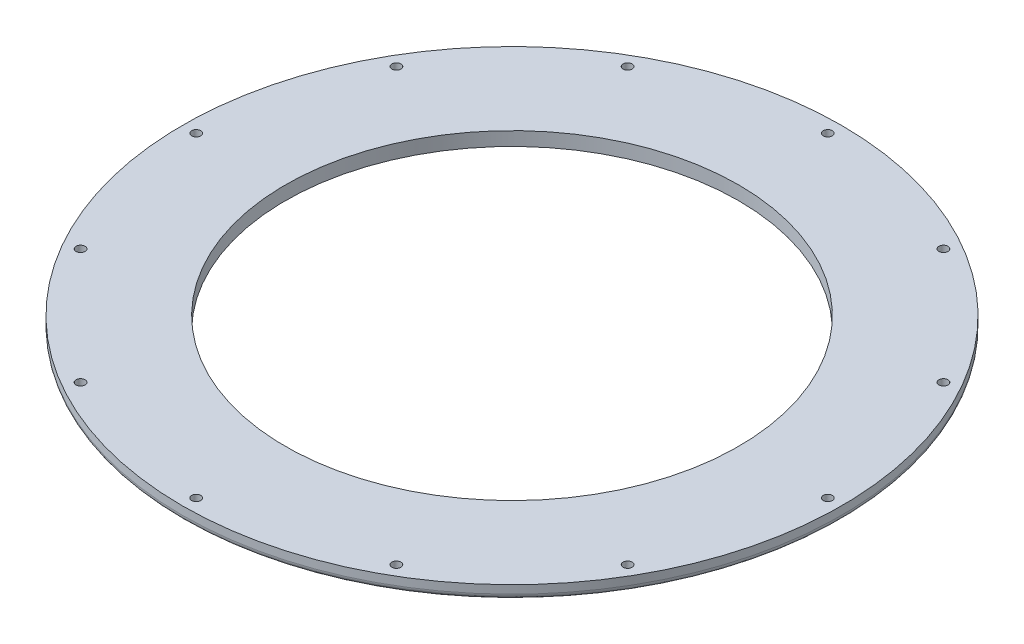
ISO-10303-21;
HEADER;
FILE_DESCRIPTION(('STEP AP214'),'2;1');
FILE_NAME('part.step','',(''),(''),'','','');
FILE_SCHEMA(('AUTOMOTIVE_DESIGN { 1 0 10303 214 1 1 1 1 }'));
ENDSEC;
DATA;
#1=APPLICATION_CONTEXT('core data for automotive mechanical design processes');
#2=APPLICATION_PROTOCOL_DEFINITION('international standard','automotive_design',2000,#1);
#3=PRODUCT_CONTEXT('',#1,'mechanical');
#4=PRODUCT('Part','Part','',(#3));
#5=PRODUCT_RELATED_PRODUCT_CATEGORY('part','',(#4));
#6=PRODUCT_DEFINITION_FORMATION('','',#4);
#7=PRODUCT_DEFINITION_CONTEXT('part definition',#1,'design');
#8=PRODUCT_DEFINITION('design','',#6,#7);
#9=PRODUCT_DEFINITION_SHAPE('','',#8);
#10=(LENGTH_UNIT() NAMED_UNIT(*) SI_UNIT(.MILLI.,.METRE.));
#11=(NAMED_UNIT(*) PLANE_ANGLE_UNIT() SI_UNIT($,.RADIAN.));
#12=(NAMED_UNIT(*) SI_UNIT($,.STERADIAN.) SOLID_ANGLE_UNIT());
#13=UNCERTAINTY_MEASURE_WITH_UNIT(LENGTH_MEASURE(1.E-05),#10,'distance_accuracy_value','');
#14=(GEOMETRIC_REPRESENTATION_CONTEXT(3) GLOBAL_UNCERTAINTY_ASSIGNED_CONTEXT((#13)) GLOBAL_UNIT_ASSIGNED_CONTEXT((#10,
#11,#12)) REPRESENTATION_CONTEXT('',''));
#15=CARTESIAN_POINT('',(0.,0.,0.));
#16=DIRECTION('',(0.,0.,1.));
#17=DIRECTION('',(1.,0.,0.));
#18=AXIS2_PLACEMENT_3D('',#15,#16,#17);
#19=CARTESIAN_POINT('',(0.,5.,0.));
#20=DIRECTION('',(0.,1.,0.));
#21=DIRECTION('',(0.,0.,-1.));
#22=AXIS2_PLACEMENT_3D('',#19,#20,#21);
#23=PLANE('',#22);
#24=CARTESIAN_POINT('',(0.,5.,-115.));
#25=DIRECTION('',(0.,-1.,0.));
#26=DIRECTION('',(0.,0.,-1.));
#27=AXIS2_PLACEMENT_3D('',#24,#25,#26);
#28=CIRCLE('',#27,1.65);
#29=CARTESIAN_POINT('',(0.,5.,-116.65));
#30=VERTEX_POINT('',#29);
#31=EDGE_CURVE('E63',#30,#30,#28,.T.);
#32=ORIENTED_EDGE('',*,*,#31,.T.);
#33=EDGE_LOOP('',(#32));
#34=FACE_BOUND('',#33,.T.);
#35=CARTESIAN_POINT('',(-57.4999999999987,5.,-99.5929214352112));
#36=DIRECTION('',(0.,-1.,0.));
#37=DIRECTION('',(0.,0.,-1.));
#38=AXIS2_PLACEMENT_3D('',#35,#36,#37);
#39=CIRCLE('',#38,1.65000000000001);
#40=CARTESIAN_POINT('',(-57.4999999999987,5.,-101.242921435211));
#41=VERTEX_POINT('',#40);
#42=EDGE_CURVE('E66',#41,#41,#39,.T.);
#43=ORIENTED_EDGE('',*,*,#42,.T.);
#44=EDGE_LOOP('',(#43));
#45=FACE_BOUND('',#44,.T.);
#46=CARTESIAN_POINT('',(-99.5929214352098,5.,-57.5000000000012));
#47=DIRECTION('',(0.,-1.,0.));
#48=DIRECTION('',(0.,0.,-1.));
#49=AXIS2_PLACEMENT_3D('',#46,#47,#48);
#50=CIRCLE('',#49,1.65);
#51=CARTESIAN_POINT('',(-99.5929214352098,5.,-59.1500000000012));
#52=VERTEX_POINT('',#51);
#53=EDGE_CURVE('E75',#52,#52,#50,.T.);
#54=ORIENTED_EDGE('',*,*,#53,.T.);
#55=EDGE_LOOP('',(#54));
#56=FACE_BOUND('',#55,.T.);
#57=CARTESIAN_POINT('',(-115.,5.,-1.20456106190088E-12));
#58=DIRECTION('',(0.,-1.,0.));
#59=DIRECTION('',(0.,0.,-1.));
#60=AXIS2_PLACEMENT_3D('',#57,#58,#59);
#61=CIRCLE('',#60,1.65);
#62=CARTESIAN_POINT('',(-115.,5.,-1.6500000000012));
#63=VERTEX_POINT('',#62);
#64=EDGE_CURVE('E73',#63,#63,#61,.T.);
#65=ORIENTED_EDGE('',*,*,#64,.T.);
#66=EDGE_LOOP('',(#65));
#67=FACE_BOUND('',#66,.T.);
#68=CARTESIAN_POINT('',(57.5000000000001,5.,-99.5929214352104));
#69=DIRECTION('',(0.,-1.,0.));
#70=DIRECTION('',(0.,0.,-1.));
#71=AXIS2_PLACEMENT_3D('',#68,#69,#70);
#72=CIRCLE('',#71,1.65000000000001);
#73=CARTESIAN_POINT('',(57.5000000000001,5.,-101.24292143521));
#74=VERTEX_POINT('',#73);
#75=EDGE_CURVE('E77',#74,#74,#72,.T.);
#76=ORIENTED_EDGE('',*,*,#75,.T.);
#77=EDGE_LOOP('',(#76));
#78=FACE_BOUND('',#77,.T.);
#79=CARTESIAN_POINT('',(99.5929214352106,5.,-57.4999999999998));
#80=DIRECTION('',(0.,-1.,0.));
#81=DIRECTION('',(0.,0.,-1.));
#82=AXIS2_PLACEMENT_3D('',#79,#80,#81);
#83=CIRCLE('',#82,1.64999999999999);
#84=CARTESIAN_POINT('',(99.5929214352106,5.,-59.1499999999998));
#85=VERTEX_POINT('',#84);
#86=EDGE_CURVE('E82',#85,#85,#83,.T.);
#87=ORIENTED_EDGE('',*,*,#86,.T.);
#88=EDGE_LOOP('',(#87));
#89=FACE_BOUND('',#88,.T.);
#90=CARTESIAN_POINT('',(115.,5.,4.0152035396696E-13));
#91=DIRECTION('',(0.,-1.,0.));
#92=DIRECTION('',(0.,0.,-1.));
#93=AXIS2_PLACEMENT_3D('',#90,#91,#92);
#94=CIRCLE('',#93,1.65);
#95=CARTESIAN_POINT('',(115.,5.,-1.6499999999996));
#96=VERTEX_POINT('',#95);
#97=EDGE_CURVE('E81',#96,#96,#94,.T.);
#98=ORIENTED_EDGE('',*,*,#97,.T.);
#99=EDGE_LOOP('',(#98));
#100=FACE_BOUND('',#99,.T.);
#101=CARTESIAN_POINT('',(99.5929214352102,5.,57.5000000000005));
#102=DIRECTION('',(0.,-1.,0.));
#103=DIRECTION('',(0.,0.,-1.));
#104=AXIS2_PLACEMENT_3D('',#101,#102,#103);
#105=CIRCLE('',#104,1.65);
#106=CARTESIAN_POINT('',(99.5929214352102,5.,55.8500000000005));
#107=VERTEX_POINT('',#106);
#108=EDGE_CURVE('E87',#107,#107,#105,.T.);
#109=ORIENTED_EDGE('',*,*,#108,.T.);
#110=EDGE_LOOP('',(#109));
#111=FACE_BOUND('',#110,.T.);
#112=CARTESIAN_POINT('',(57.4999999999994,5.,99.5929214352108));
#113=DIRECTION('',(0.,-1.,0.));
#114=DIRECTION('',(0.,0.,-1.));
#115=AXIS2_PLACEMENT_3D('',#112,#113,#114);
#116=CIRCLE('',#115,1.65);
#117=CARTESIAN_POINT('',(57.4999999999994,5.,97.9429214352108));
#118=VERTEX_POINT('',#117);
#119=EDGE_CURVE('E89',#118,#118,#116,.T.);
#120=ORIENTED_EDGE('',*,*,#119,.T.);
#121=EDGE_LOOP('',(#120));
#122=FACE_BOUND('',#121,.T.);
#123=CARTESIAN_POINT('',(-8.03040707933921E-13,5.,115.));
#124=DIRECTION('',(0.,-1.,0.));
#125=DIRECTION('',(0.,0.,-1.));
#126=AXIS2_PLACEMENT_3D('',#123,#124,#125);
#127=CIRCLE('',#126,1.65);
#128=CARTESIAN_POINT('',(-8.03040707933921E-13,5.,113.35));
#129=VERTEX_POINT('',#128);
#130=EDGE_CURVE('E91',#129,#129,#127,.T.);
#131=ORIENTED_EDGE('',*,*,#130,.T.);
#132=EDGE_LOOP('',(#131));
#133=FACE_BOUND('',#132,.T.);
#134=CARTESIAN_POINT('',(-57.5000000000008,5.,99.59292143521));
#135=DIRECTION('',(0.,-1.,0.));
#136=DIRECTION('',(0.,0.,-1.));
#137=AXIS2_PLACEMENT_3D('',#134,#135,#136);
#138=CIRCLE('',#137,1.65);
#139=CARTESIAN_POINT('',(-57.5000000000008,5.,97.94292143521));
#140=VERTEX_POINT('',#139);
#141=EDGE_CURVE('E96',#140,#140,#138,.T.);
#142=ORIENTED_EDGE('',*,*,#141,.T.);
#143=EDGE_LOOP('',(#142));
#144=FACE_BOUND('',#143,.T.);
#145=CARTESIAN_POINT('',(-99.592921435211,5.,57.4999999999991));
#146=DIRECTION('',(0.,-1.,0.));
#147=DIRECTION('',(0.,0.,-1.));
#148=AXIS2_PLACEMENT_3D('',#145,#146,#147);
#149=CIRCLE('',#148,1.65);
#150=CARTESIAN_POINT('',(-99.592921435211,5.,55.8499999999991));
#151=VERTEX_POINT('',#150);
#152=EDGE_CURVE('E97',#151,#151,#149,.T.);
#153=ORIENTED_EDGE('',*,*,#152,.T.);
#154=EDGE_LOOP('',(#153));
#155=FACE_BOUND('',#154,.T.);
#156=CARTESIAN_POINT('',(0.,5.,0.));
#157=DIRECTION('',(0.,-1.,0.));
#158=DIRECTION('',(0.,0.,-1.));
#159=AXIS2_PLACEMENT_3D('',#156,#157,#158);
#160=CIRCLE('',#159,120.);
#161=CARTESIAN_POINT('',(0.,5.,-120.));
#162=VERTEX_POINT('',#161);
#163=EDGE_CURVE('E53',#162,#162,#160,.T.);
#164=ORIENTED_EDGE('',*,*,#163,.F.);
#165=EDGE_LOOP('',(#164));
#166=FACE_BOUND('',#165,.T.);
#167=CARTESIAN_POINT('',(0.,5.,0.));
#168=DIRECTION('',(0.,-1.,0.));
#169=DIRECTION('',(0.,0.,-1.));
#170=AXIS2_PLACEMENT_3D('',#167,#168,#169);
#171=CIRCLE('',#170,82.5);
#172=CARTESIAN_POINT('',(0.,5.,-82.5));
#173=VERTEX_POINT('',#172);
#174=EDGE_CURVE('E59',#173,#173,#171,.T.);
#175=ORIENTED_EDGE('',*,*,#174,.T.);
#176=EDGE_LOOP('',(#175));
#177=FACE_BOUND('',#176,.T.);
#178=ADVANCED_FACE('F43',(#34,#45,#56,#67,#78,#89,#100,#111,#122,#133,#144,#155,#166,#177),#23,.T.);
#179=CARTESIAN_POINT('',(0.,0.,0.));
#180=DIRECTION('',(0.,1.,0.));
#181=DIRECTION('',(0.,0.,-1.));
#182=AXIS2_PLACEMENT_3D('',#179,#180,#181);
#183=PLANE('',#182);
#184=CARTESIAN_POINT('',(0.,0.,-115.));
#185=DIRECTION('',(0.,1.,0.));
#186=DIRECTION('',(0.,0.,1.));
#187=AXIS2_PLACEMENT_3D('',#184,#185,#186);
#188=CIRCLE('',#187,1.65);
#189=CARTESIAN_POINT('',(0.,0.,-113.35));
#190=VERTEX_POINT('',#189);
#191=EDGE_CURVE('E105',#190,#190,#188,.T.);
#192=ORIENTED_EDGE('',*,*,#191,.T.);
#193=EDGE_LOOP('',(#192));
#194=FACE_BOUND('',#193,.T.);
#195=CARTESIAN_POINT('',(-57.4999999999987,0.,-99.5929214352112));
#196=DIRECTION('',(0.,1.,0.));
#197=DIRECTION('',(0.,0.,1.));
#198=AXIS2_PLACEMENT_3D('',#195,#196,#197);
#199=CIRCLE('',#198,1.65000000000001);
#200=CARTESIAN_POINT('',(-57.4999999999987,0.,-97.9429214352112));
#201=VERTEX_POINT('',#200);
#202=EDGE_CURVE('E126',#201,#201,#199,.T.);
#203=ORIENTED_EDGE('',*,*,#202,.T.);
#204=EDGE_LOOP('',(#203));
#205=FACE_BOUND('',#204,.T.);
#206=CARTESIAN_POINT('',(-99.5929214352098,0.,-57.5000000000012));
#207=DIRECTION('',(0.,1.,0.));
#208=DIRECTION('',(0.,0.,1.));
#209=AXIS2_PLACEMENT_3D('',#206,#207,#208);
#210=CIRCLE('',#209,1.65);
#211=CARTESIAN_POINT('',(-99.5929214352098,0.,-55.8500000000012));
#212=VERTEX_POINT('',#211);
#213=EDGE_CURVE('E131',#212,#212,#210,.T.);
#214=ORIENTED_EDGE('',*,*,#213,.T.);
#215=EDGE_LOOP('',(#214));
#216=FACE_BOUND('',#215,.T.);
#217=CARTESIAN_POINT('',(-115.,0.,-1.20456106190088E-12));
#218=DIRECTION('',(0.,1.,0.));
#219=DIRECTION('',(0.,0.,1.));
#220=AXIS2_PLACEMENT_3D('',#217,#218,#219);
#221=CIRCLE('',#220,1.65);
#222=CARTESIAN_POINT('',(-115.,0.,1.6499999999988));
#223=VERTEX_POINT('',#222);
#224=EDGE_CURVE('E119',#223,#223,#221,.T.);
#225=ORIENTED_EDGE('',*,*,#224,.T.);
#226=EDGE_LOOP('',(#225));
#227=FACE_BOUND('',#226,.T.);
#228=CARTESIAN_POINT('',(57.5000000000001,0.,-99.5929214352104));
#229=DIRECTION('',(0.,1.,0.));
#230=DIRECTION('',(0.,0.,1.));
#231=AXIS2_PLACEMENT_3D('',#228,#229,#230);
#232=CIRCLE('',#231,1.65000000000001);
#233=CARTESIAN_POINT('',(57.5000000000001,0.,-97.9429214352104));
#234=VERTEX_POINT('',#233);
#235=EDGE_CURVE('E114',#234,#234,#232,.T.);
#236=ORIENTED_EDGE('',*,*,#235,.T.);
#237=EDGE_LOOP('',(#236));
#238=FACE_BOUND('',#237,.T.);
#239=CARTESIAN_POINT('',(99.5929214352106,0.,-57.4999999999998));
#240=DIRECTION('',(0.,1.,0.));
#241=DIRECTION('',(0.,0.,1.));
#242=AXIS2_PLACEMENT_3D('',#239,#240,#241);
#243=CIRCLE('',#242,1.64999999999999);
#244=CARTESIAN_POINT('',(99.5929214352106,0.,-55.8499999999998));
#245=VERTEX_POINT('',#244);
#246=EDGE_CURVE('E109',#245,#245,#243,.T.);
#247=ORIENTED_EDGE('',*,*,#246,.T.);
#248=EDGE_LOOP('',(#247));
#249=FACE_BOUND('',#248,.T.);
#250=CARTESIAN_POINT('',(115.,0.,4.0152035396696E-13));
#251=DIRECTION('',(0.,1.,0.));
#252=DIRECTION('',(0.,0.,1.));
#253=AXIS2_PLACEMENT_3D('',#250,#251,#252);
#254=CIRCLE('',#253,1.65);
#255=CARTESIAN_POINT('',(115.,0.,1.6500000000004));
#256=VERTEX_POINT('',#255);
#257=EDGE_CURVE('E106',#256,#256,#254,.T.);
#258=ORIENTED_EDGE('',*,*,#257,.T.);
#259=EDGE_LOOP('',(#258));
#260=FACE_BOUND('',#259,.T.);
#261=CARTESIAN_POINT('',(99.5929214352102,0.,57.5000000000005));
#262=DIRECTION('',(0.,1.,0.));
#263=DIRECTION('',(0.,0.,1.));
#264=AXIS2_PLACEMENT_3D('',#261,#262,#263);
#265=CIRCLE('',#264,1.65);
#266=CARTESIAN_POINT('',(99.5929214352102,0.,59.1500000000005));
#267=VERTEX_POINT('',#266);
#268=EDGE_CURVE('E103',#267,#267,#265,.T.);
#269=ORIENTED_EDGE('',*,*,#268,.T.);
#270=EDGE_LOOP('',(#269));
#271=FACE_BOUND('',#270,.T.);
#272=CARTESIAN_POINT('',(57.4999999999994,0.,99.5929214352108));
#273=DIRECTION('',(0.,1.,0.));
#274=DIRECTION('',(0.,0.,1.));
#275=AXIS2_PLACEMENT_3D('',#272,#273,#274);
#276=CIRCLE('',#275,1.65);
#277=CARTESIAN_POINT('',(57.4999999999994,0.,101.242921435211));
#278=VERTEX_POINT('',#277);
#279=EDGE_CURVE('E110',#278,#278,#276,.T.);
#280=ORIENTED_EDGE('',*,*,#279,.T.);
#281=EDGE_LOOP('',(#280));
#282=FACE_BOUND('',#281,.T.);
#283=CARTESIAN_POINT('',(-8.03040707933921E-13,0.,115.));
#284=DIRECTION('',(0.,1.,0.));
#285=DIRECTION('',(0.,0.,1.));
#286=AXIS2_PLACEMENT_3D('',#283,#284,#285);
#287=CIRCLE('',#286,1.65);
#288=CARTESIAN_POINT('',(-8.03040707933921E-13,0.,116.65));
#289=VERTEX_POINT('',#288);
#290=EDGE_CURVE('E125',#289,#289,#287,.T.);
#291=ORIENTED_EDGE('',*,*,#290,.T.);
#292=EDGE_LOOP('',(#291));
#293=FACE_BOUND('',#292,.T.);
#294=CARTESIAN_POINT('',(-57.5000000000008,0.,99.59292143521));
#295=DIRECTION('',(0.,1.,0.));
#296=DIRECTION('',(0.,0.,1.));
#297=AXIS2_PLACEMENT_3D('',#294,#295,#296);
#298=CIRCLE('',#297,1.65);
#299=CARTESIAN_POINT('',(-57.5000000000008,0.,101.24292143521));
#300=VERTEX_POINT('',#299);
#301=EDGE_CURVE('E118',#300,#300,#298,.T.);
#302=ORIENTED_EDGE('',*,*,#301,.T.);
#303=EDGE_LOOP('',(#302));
#304=FACE_BOUND('',#303,.T.);
#305=CARTESIAN_POINT('',(-99.592921435211,0.,57.4999999999991));
#306=DIRECTION('',(0.,1.,0.));
#307=DIRECTION('',(0.,0.,1.));
#308=AXIS2_PLACEMENT_3D('',#305,#306,#307);
#309=CIRCLE('',#308,1.65);
#310=CARTESIAN_POINT('',(-99.592921435211,0.,59.1499999999991));
#311=VERTEX_POINT('',#310);
#312=EDGE_CURVE('E116',#311,#311,#309,.T.);
#313=ORIENTED_EDGE('',*,*,#312,.T.);
#314=EDGE_LOOP('',(#313));
#315=FACE_BOUND('',#314,.T.);
#316=CARTESIAN_POINT('',(0.,0.,0.));
#317=DIRECTION('',(0.,-1.,0.));
#318=DIRECTION('',(0.,0.,-1.));
#319=AXIS2_PLACEMENT_3D('',#316,#317,#318);
#320=CIRCLE('',#319,118.);
#321=CARTESIAN_POINT('',(0.,0.,-118.));
#322=VERTEX_POINT('',#321);
#323=EDGE_CURVE('E10',#322,#322,#320,.F.);
#324=ORIENTED_EDGE('',*,*,#323,.F.);
#325=EDGE_LOOP('',(#324));
#326=FACE_BOUND('',#325,.T.);
#327=CARTESIAN_POINT('',(0.,0.,0.));
#328=DIRECTION('',(0.,-1.,0.));
#329=DIRECTION('',(0.,0.,-1.));
#330=AXIS2_PLACEMENT_3D('',#327,#328,#329);
#331=CIRCLE('',#330,82.5);
#332=CARTESIAN_POINT('',(0.,0.,-82.5));
#333=VERTEX_POINT('',#332);
#334=EDGE_CURVE('E61',#333,#333,#331,.T.);
#335=ORIENTED_EDGE('',*,*,#334,.F.);
#336=EDGE_LOOP('',(#335));
#337=FACE_BOUND('',#336,.T.);
#338=ADVANCED_FACE('F136',(#194,#205,#216,#227,#238,#249,#260,#271,#282,#293,#304,#315,#326,
#337),#183,.F.);
#339=CARTESIAN_POINT('',(0.,5.,0.));
#340=DIRECTION('',(0.,-1.,0.));
#341=DIRECTION('',(0.,0.,1.));
#342=AXIS2_PLACEMENT_3D('',#339,#340,#341);
#343=CYLINDRICAL_SURFACE('',#342,120.);
#344=CARTESIAN_POINT('',(0.,2.,0.));
#345=DIRECTION('',(0.,-1.,0.));
#346=DIRECTION('',(0.,0.,-1.));
#347=AXIS2_PLACEMENT_3D('',#344,#345,#346);
#348=CIRCLE('',#347,120.);
#349=CARTESIAN_POINT('',(0.,2.,-120.));
#350=VERTEX_POINT('',#349);
#351=EDGE_CURVE('E49',#350,#350,#348,.T.);
#352=ORIENTED_EDGE('',*,*,#351,.F.);
#353=EDGE_LOOP('',(#352));
#354=FACE_BOUND('',#353,.T.);
#355=ORIENTED_EDGE('',*,*,#163,.T.);
#356=EDGE_LOOP('',(#355));
#357=FACE_BOUND('',#356,.T.);
#358=ADVANCED_FACE('F161',(#354,#357),#343,.T.);
#359=CARTESIAN_POINT('',(0.,5.,0.));
#360=DIRECTION('',(0.,-1.,0.));
#361=DIRECTION('',(0.,0.,1.));
#362=AXIS2_PLACEMENT_3D('',#359,#360,#361);
#363=CYLINDRICAL_SURFACE('',#362,82.5);
#364=ORIENTED_EDGE('',*,*,#174,.F.);
#365=EDGE_LOOP('',(#364));
#366=FACE_BOUND('',#365,.T.);
#367=ORIENTED_EDGE('',*,*,#334,.T.);
#368=EDGE_LOOP('',(#367));
#369=FACE_BOUND('',#368,.T.);
#370=ADVANCED_FACE('F164',(#366,#369),#363,.F.);
#371=CARTESIAN_POINT('',(0.,2.,0.));
#372=DIRECTION('',(0.,1.,0.));
#373=DIRECTION('',(0.,0.,-1.));
#374=AXIS2_PLACEMENT_3D('',#371,#372,#373);
#375=TOROIDAL_SURFACE('',#374,118.,2.);
#376=ORIENTED_EDGE('',*,*,#323,.T.);
#377=EDGE_LOOP('',(#376));
#378=FACE_BOUND('',#377,.T.);
#379=ORIENTED_EDGE('',*,*,#351,.T.);
#380=EDGE_LOOP('',(#379));
#381=FACE_BOUND('',#380,.T.);
#382=ADVANCED_FACE('F44',(#378,#381),#375,.T.);
#383=CARTESIAN_POINT('',(-99.592921435211,8.,57.4999999999991));
#384=DIRECTION('',(0.,-1.,0.));
#385=DIRECTION('',(0.,0.,1.));
#386=AXIS2_PLACEMENT_3D('',#383,#384,#385);
#387=CYLINDRICAL_SURFACE('',#386,1.65);
#388=ORIENTED_EDGE('',*,*,#152,.F.);
#389=EDGE_LOOP('',(#388));
#390=FACE_BOUND('',#389,.T.);
#391=ORIENTED_EDGE('',*,*,#312,.F.);
#392=EDGE_LOOP('',(#391));
#393=FACE_BOUND('',#392,.T.);
#394=ADVANCED_FACE('F184',(#390,#393),#387,.F.);
#395=CARTESIAN_POINT('',(-57.5000000000008,8.,99.59292143521));
#396=DIRECTION('',(0.,-1.,0.));
#397=DIRECTION('',(0.,0.,1.));
#398=AXIS2_PLACEMENT_3D('',#395,#396,#397);
#399=CYLINDRICAL_SURFACE('',#398,1.65);
#400=ORIENTED_EDGE('',*,*,#141,.F.);
#401=EDGE_LOOP('',(#400));
#402=FACE_BOUND('',#401,.T.);
#403=ORIENTED_EDGE('',*,*,#301,.F.);
#404=EDGE_LOOP('',(#403));
#405=FACE_BOUND('',#404,.T.);
#406=ADVANCED_FACE('F187',(#402,#405),#399,.F.);
#407=CARTESIAN_POINT('',(-8.03040707933921E-13,8.,115.));
#408=DIRECTION('',(0.,-1.,0.));
#409=DIRECTION('',(0.,0.,1.));
#410=AXIS2_PLACEMENT_3D('',#407,#408,#409);
#411=CYLINDRICAL_SURFACE('',#410,1.65);
#412=ORIENTED_EDGE('',*,*,#130,.F.);
#413=EDGE_LOOP('',(#412));
#414=FACE_BOUND('',#413,.T.);
#415=ORIENTED_EDGE('',*,*,#290,.F.);
#416=EDGE_LOOP('',(#415));
#417=FACE_BOUND('',#416,.T.);
#418=ADVANCED_FACE('F191',(#414,#417),#411,.F.);
#419=CARTESIAN_POINT('',(57.4999999999994,8.,99.5929214352108));
#420=DIRECTION('',(0.,-1.,0.));
#421=DIRECTION('',(0.,0.,1.));
#422=AXIS2_PLACEMENT_3D('',#419,#420,#421);
#423=CYLINDRICAL_SURFACE('',#422,1.65);
#424=ORIENTED_EDGE('',*,*,#119,.F.);
#425=EDGE_LOOP('',(#424));
#426=FACE_BOUND('',#425,.T.);
#427=ORIENTED_EDGE('',*,*,#279,.F.);
#428=EDGE_LOOP('',(#427));
#429=FACE_BOUND('',#428,.T.);
#430=ADVANCED_FACE('F214',(#426,#429),#423,.F.);
#431=CARTESIAN_POINT('',(99.5929214352102,8.,57.5000000000005));
#432=DIRECTION('',(0.,-1.,0.));
#433=DIRECTION('',(0.,0.,1.));
#434=AXIS2_PLACEMENT_3D('',#431,#432,#433);
#435=CYLINDRICAL_SURFACE('',#434,1.65);
#436=ORIENTED_EDGE('',*,*,#108,.F.);
#437=EDGE_LOOP('',(#436));
#438=FACE_BOUND('',#437,.T.);
#439=ORIENTED_EDGE('',*,*,#268,.F.);
#440=EDGE_LOOP('',(#439));
#441=FACE_BOUND('',#440,.T.);
#442=ADVANCED_FACE('F215',(#438,#441),#435,.F.);
#443=CARTESIAN_POINT('',(115.,8.,4.0152035396696E-13));
#444=DIRECTION('',(0.,-1.,0.));
#445=DIRECTION('',(0.,0.,1.));
#446=AXIS2_PLACEMENT_3D('',#443,#444,#445);
#447=CYLINDRICAL_SURFACE('',#446,1.65);
#448=ORIENTED_EDGE('',*,*,#97,.F.);
#449=EDGE_LOOP('',(#448));
#450=FACE_BOUND('',#449,.T.);
#451=ORIENTED_EDGE('',*,*,#257,.F.);
#452=EDGE_LOOP('',(#451));
#453=FACE_BOUND('',#452,.T.);
#454=ADVANCED_FACE('F207',(#450,#453),#447,.F.);
#455=CARTESIAN_POINT('',(99.5929214352106,8.,-57.4999999999998));
#456=DIRECTION('',(0.,-1.,0.));
#457=DIRECTION('',(0.,0.,1.));
#458=AXIS2_PLACEMENT_3D('',#455,#456,#457);
#459=CYLINDRICAL_SURFACE('',#458,1.64999999999999);
#460=ORIENTED_EDGE('',*,*,#86,.F.);
#461=EDGE_LOOP('',(#460));
#462=FACE_BOUND('',#461,.T.);
#463=ORIENTED_EDGE('',*,*,#246,.F.);
#464=EDGE_LOOP('',(#463));
#465=FACE_BOUND('',#464,.T.);
#466=ADVANCED_FACE('F202',(#462,#465),#459,.F.);
#467=CARTESIAN_POINT('',(57.5000000000001,8.,-99.5929214352104));
#468=DIRECTION('',(0.,-1.,0.));
#469=DIRECTION('',(0.,0.,1.));
#470=AXIS2_PLACEMENT_3D('',#467,#468,#469);
#471=CYLINDRICAL_SURFACE('',#470,1.65000000000001);
#472=ORIENTED_EDGE('',*,*,#75,.F.);
#473=EDGE_LOOP('',(#472));
#474=FACE_BOUND('',#473,.T.);
#475=ORIENTED_EDGE('',*,*,#235,.F.);
#476=EDGE_LOOP('',(#475));
#477=FACE_BOUND('',#476,.T.);
#478=ADVANCED_FACE('F203',(#474,#477),#471,.F.);
#479=CARTESIAN_POINT('',(-115.,8.,-1.20456106190088E-12));
#480=DIRECTION('',(0.,-1.,0.));
#481=DIRECTION('',(0.,0.,1.));
#482=AXIS2_PLACEMENT_3D('',#479,#480,#481);
#483=CYLINDRICAL_SURFACE('',#482,1.65);
#484=ORIENTED_EDGE('',*,*,#64,.F.);
#485=EDGE_LOOP('',(#484));
#486=FACE_BOUND('',#485,.T.);
#487=ORIENTED_EDGE('',*,*,#224,.F.);
#488=EDGE_LOOP('',(#487));
#489=FACE_BOUND('',#488,.T.);
#490=ADVANCED_FACE('F204',(#486,#489),#483,.F.);
#491=CARTESIAN_POINT('',(-99.5929214352098,8.,-57.5000000000012));
#492=DIRECTION('',(0.,-1.,0.));
#493=DIRECTION('',(0.,0.,1.));
#494=AXIS2_PLACEMENT_3D('',#491,#492,#493);
#495=CYLINDRICAL_SURFACE('',#494,1.65);
#496=ORIENTED_EDGE('',*,*,#53,.F.);
#497=EDGE_LOOP('',(#496));
#498=FACE_BOUND('',#497,.T.);
#499=ORIENTED_EDGE('',*,*,#213,.F.);
#500=EDGE_LOOP('',(#499));
#501=FACE_BOUND('',#500,.T.);
#502=ADVANCED_FACE('F147',(#498,#501),#495,.F.);
#503=CARTESIAN_POINT('',(-57.4999999999987,8.,-99.5929214352112));
#504=DIRECTION('',(0.,-1.,0.));
#505=DIRECTION('',(0.,0.,1.));
#506=AXIS2_PLACEMENT_3D('',#503,#504,#505);
#507=CYLINDRICAL_SURFACE('',#506,1.65000000000001);
#508=ORIENTED_EDGE('',*,*,#42,.F.);
#509=EDGE_LOOP('',(#508));
#510=FACE_BOUND('',#509,.T.);
#511=ORIENTED_EDGE('',*,*,#202,.F.);
#512=EDGE_LOOP('',(#511));
#513=FACE_BOUND('',#512,.T.);
#514=ADVANCED_FACE('F145',(#510,#513),#507,.F.);
#515=CARTESIAN_POINT('',(0.,8.,-115.));
#516=DIRECTION('',(0.,-1.,0.));
#517=DIRECTION('',(0.,0.,1.));
#518=AXIS2_PLACEMENT_3D('',#515,#516,#517);
#519=CYLINDRICAL_SURFACE('',#518,1.65);
#520=ORIENTED_EDGE('',*,*,#31,.F.);
#521=EDGE_LOOP('',(#520));
#522=FACE_BOUND('',#521,.T.);
#523=ORIENTED_EDGE('',*,*,#191,.F.);
#524=EDGE_LOOP('',(#523));
#525=FACE_BOUND('',#524,.T.);
#526=ADVANCED_FACE('F142',(#522,#525),#519,.F.);
#527=CLOSED_SHELL('',(#178,#338,#358,#370,#382,#394,#406,#418,#430,#442,#454,#466,#478,#490,
#502,#514,#526));
#528=MANIFOLD_SOLID_BREP('B2',#527);
#529=ADVANCED_BREP_SHAPE_REPRESENTATION('',(#18,#528),#14);
#530=SHAPE_DEFINITION_REPRESENTATION(#9,#529);
ENDSEC;
END-ISO-10303-21;
